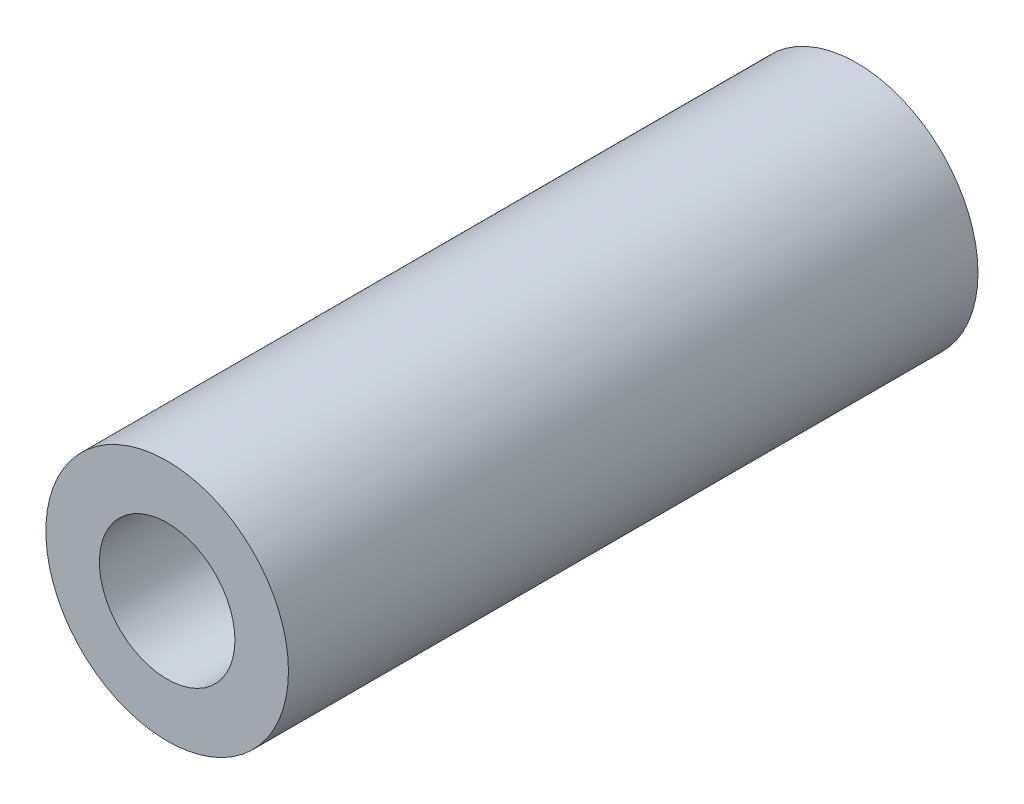
ISO-10303-21;
HEADER;
FILE_DESCRIPTION(('STEP AP214'),'2;1');
FILE_NAME('part.step','',(''),(''),'','','');
FILE_SCHEMA(('AUTOMOTIVE_DESIGN { 1 0 10303 214 1 1 1 1 }'));
ENDSEC;
DATA;
#1=APPLICATION_CONTEXT('core data for automotive mechanical design processes');
#2=APPLICATION_PROTOCOL_DEFINITION('international standard','automotive_design',2000,#1);
#3=PRODUCT_CONTEXT('',#1,'mechanical');
#4=PRODUCT('Part','Part','',(#3));
#5=PRODUCT_RELATED_PRODUCT_CATEGORY('part','',(#4));
#6=PRODUCT_DEFINITION_FORMATION('','',#4);
#7=PRODUCT_DEFINITION_CONTEXT('part definition',#1,'design');
#8=PRODUCT_DEFINITION('design','',#6,#7);
#9=PRODUCT_DEFINITION_SHAPE('','',#8);
#10=(LENGTH_UNIT() NAMED_UNIT(*) SI_UNIT(.MILLI.,.METRE.));
#11=(NAMED_UNIT(*) PLANE_ANGLE_UNIT() SI_UNIT($,.RADIAN.));
#12=(NAMED_UNIT(*) SI_UNIT($,.STERADIAN.) SOLID_ANGLE_UNIT());
#13=UNCERTAINTY_MEASURE_WITH_UNIT(LENGTH_MEASURE(1.E-05),#10,'distance_accuracy_value','');
#14=(GEOMETRIC_REPRESENTATION_CONTEXT(3) GLOBAL_UNCERTAINTY_ASSIGNED_CONTEXT((#13)) GLOBAL_UNIT_ASSIGNED_CONTEXT((#10,
#11,#12)) REPRESENTATION_CONTEXT('',''));
#15=CARTESIAN_POINT('',(0.,0.,0.));
#16=DIRECTION('',(0.,0.,1.));
#17=DIRECTION('',(1.,0.,0.));
#18=AXIS2_PLACEMENT_3D('',#15,#16,#17);
#19=CARTESIAN_POINT('',(61.1,59.9,26.5));
#20=DIRECTION('',(0.,0.,1.));
#21=DIRECTION('',(1.,0.,0.));
#22=AXIS2_PLACEMENT_3D('',#19,#20,#21);
#23=CYLINDRICAL_SURFACE('',#22,2.15);
#24=DIRECTION('',(0.,0.,1.));
#25=VECTOR('',#24,1.);
#26=CARTESIAN_POINT('',(63.25,59.9,26.5));
#27=LINE('',#26,#25);
#28=CARTESIAN_POINT('',(63.25,59.9,27.));
#29=VERTEX_POINT('',#28);
#30=CARTESIAN_POINT('',(63.25,59.9,48.884118852459));
#31=VERTEX_POINT('',#30);
#32=EDGE_CURVE('E10',#29,#31,#27,.T.);
#33=ORIENTED_EDGE('',*,*,#32,.F.);
#34=CARTESIAN_POINT('',(61.1,59.9,27.));
#35=DIRECTION('',(0.,0.,1.));
#36=DIRECTION('',(1.,0.,0.));
#37=AXIS2_PLACEMENT_3D('',#34,#35,#36);
#38=CIRCLE('',#37,2.15);
#39=EDGE_CURVE('E19',#29,#29,#38,.T.);
#40=ORIENTED_EDGE('',*,*,#39,.F.);
#41=ORIENTED_EDGE('',*,*,#32,.T.);
#42=CARTESIAN_POINT('',(61.1,59.9,48.884118852459));
#43=DIRECTION('',(0.,0.,1.));
#44=DIRECTION('',(1.,0.,0.));
#45=AXIS2_PLACEMENT_3D('',#42,#43,#44);
#46=CIRCLE('',#45,2.15);
#47=EDGE_CURVE('E65',#31,#31,#46,.T.);
#48=ORIENTED_EDGE('',*,*,#47,.T.);
#49=EDGE_LOOP('',(#33,#40,#41,#48));
#50=FACE_BOUND('',#49,.T.);
#51=ADVANCED_FACE('F15',(#50),#23,.F.);
#52=CARTESIAN_POINT('',(61.1,59.9,27.));
#53=DIRECTION('',(0.,0.,1.));
#54=DIRECTION('',(1.,0.,0.));
#55=AXIS2_PLACEMENT_3D('',#52,#53,#54);
#56=PLANE('',#55);
#57=ORIENTED_EDGE('',*,*,#39,.T.);
#58=EDGE_LOOP('',(#57));
#59=FACE_BOUND('',#58,.T.);
#60=CARTESIAN_POINT('',(61.1,59.9,27.));
#61=DIRECTION('',(0.,0.,1.));
#62=DIRECTION('',(1.,0.,0.));
#63=AXIS2_PLACEMENT_3D('',#60,#61,#62);
#64=CIRCLE('',#63,3.85);
#65=CARTESIAN_POINT('',(64.95,59.9,27.));
#66=VERTEX_POINT('',#65);
#67=EDGE_CURVE('E56',#66,#66,#64,.T.);
#68=ORIENTED_EDGE('',*,*,#67,.F.);
#69=EDGE_LOOP('',(#68));
#70=FACE_BOUND('',#69,.T.);
#71=ADVANCED_FACE('F73',(#59,#70),#56,.F.);
#72=CARTESIAN_POINT('',(61.1,59.9,48.884118852459));
#73=DIRECTION('',(0.,0.,1.));
#74=DIRECTION('',(1.,0.,0.));
#75=AXIS2_PLACEMENT_3D('',#72,#73,#74);
#76=PLANE('',#75);
#77=ORIENTED_EDGE('',*,*,#47,.F.);
#78=EDGE_LOOP('',(#77));
#79=FACE_BOUND('',#78,.T.);
#80=CARTESIAN_POINT('',(61.1,59.9,48.884118852459));
#81=DIRECTION('',(0.,0.,1.));
#82=DIRECTION('',(1.,0.,0.));
#83=AXIS2_PLACEMENT_3D('',#80,#81,#82);
#84=CIRCLE('',#83,3.85);
#85=CARTESIAN_POINT('',(64.95,59.9,48.884118852459));
#86=VERTEX_POINT('',#85);
#87=EDGE_CURVE('E54',#86,#86,#84,.T.);
#88=ORIENTED_EDGE('',*,*,#87,.T.);
#89=EDGE_LOOP('',(#88));
#90=FACE_BOUND('',#89,.T.);
#91=ADVANCED_FACE('F17',(#79,#90),#76,.T.);
#92=CARTESIAN_POINT('',(61.1,59.9,27.));
#93=DIRECTION('',(0.,0.,1.));
#94=DIRECTION('',(1.,0.,0.));
#95=AXIS2_PLACEMENT_3D('',#92,#93,#94);
#96=CYLINDRICAL_SURFACE('',#95,3.85);
#97=ORIENTED_EDGE('',*,*,#87,.F.);
#98=DIRECTION('',(0.,0.,1.));
#99=VECTOR('',#98,1.);
#100=CARTESIAN_POINT('',(64.95,59.9,27.));
#101=LINE('',#100,#99);
#102=EDGE_CURVE('E51',#66,#86,#101,.T.);
#103=ORIENTED_EDGE('',*,*,#102,.F.);
#104=ORIENTED_EDGE('',*,*,#67,.T.);
#105=ORIENTED_EDGE('',*,*,#102,.T.);
#106=EDGE_LOOP('',(#97,#103,#104,#105));
#107=FACE_BOUND('',#106,.T.);
#108=ADVANCED_FACE('F53',(#107),#96,.T.);
#109=CLOSED_SHELL('',(#51,#71,#91,#108));
#110=MANIFOLD_SOLID_BREP('B1',#109);
#111=ADVANCED_BREP_SHAPE_REPRESENTATION('',(#18,#110),#14);
#112=SHAPE_DEFINITION_REPRESENTATION(#9,#111);
ENDSEC;
END-ISO-10303-21;
